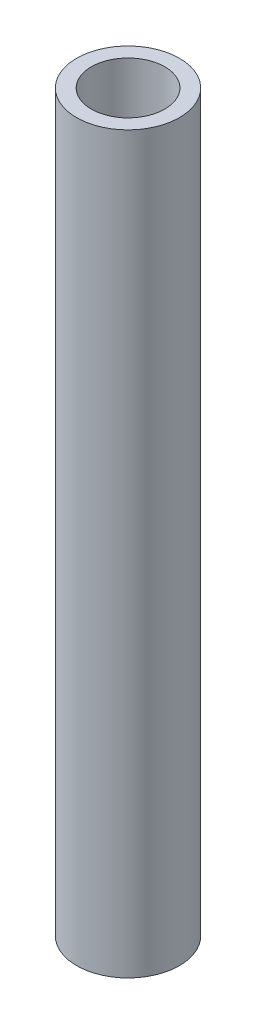
ISO-10303-21;
HEADER;
FILE_DESCRIPTION(('STEP AP214'),'2;1');
FILE_NAME('part.step','',(''),(''),'','','');
FILE_SCHEMA(('AUTOMOTIVE_DESIGN { 1 0 10303 214 1 1 1 1 }'));
ENDSEC;
DATA;
#1=APPLICATION_CONTEXT('core data for automotive mechanical design processes');
#2=APPLICATION_PROTOCOL_DEFINITION('international standard','automotive_design',2000,#1);
#3=PRODUCT_CONTEXT('',#1,'mechanical');
#4=PRODUCT('Part','Part','',(#3));
#5=PRODUCT_RELATED_PRODUCT_CATEGORY('part','',(#4));
#6=PRODUCT_DEFINITION_FORMATION('','',#4);
#7=PRODUCT_DEFINITION_CONTEXT('part definition',#1,'design');
#8=PRODUCT_DEFINITION('design','',#6,#7);
#9=PRODUCT_DEFINITION_SHAPE('','',#8);
#10=(LENGTH_UNIT() NAMED_UNIT(*) SI_UNIT(.MILLI.,.METRE.));
#11=(NAMED_UNIT(*) PLANE_ANGLE_UNIT() SI_UNIT($,.RADIAN.));
#12=(NAMED_UNIT(*) SI_UNIT($,.STERADIAN.) SOLID_ANGLE_UNIT());
#13=UNCERTAINTY_MEASURE_WITH_UNIT(LENGTH_MEASURE(1.E-05),#10,'distance_accuracy_value','');
#14=(GEOMETRIC_REPRESENTATION_CONTEXT(3) GLOBAL_UNCERTAINTY_ASSIGNED_CONTEXT((#13)) GLOBAL_UNIT_ASSIGNED_CONTEXT((#10,
#11,#12)) REPRESENTATION_CONTEXT('',''));
#15=CARTESIAN_POINT('',(0.,0.,0.));
#16=DIRECTION('',(0.,0.,1.));
#17=DIRECTION('',(1.,0.,0.));
#18=AXIS2_PLACEMENT_3D('',#15,#16,#17);
#19=CARTESIAN_POINT('',(0.,0.,0.));
#20=DIRECTION('',(0.,-1.,0.));
#21=DIRECTION('',(0.,0.,-1.));
#22=AXIS2_PLACEMENT_3D('',#19,#20,#21);
#23=CYLINDRICAL_SURFACE('',#22,1.5);
#24=CARTESIAN_POINT('',(0.,30.,0.));
#25=DIRECTION('',(0.,-1.,0.));
#26=DIRECTION('',(0.,0.,-1.));
#27=AXIS2_PLACEMENT_3D('',#24,#25,#26);
#28=CIRCLE('',#27,1.5);
#29=CARTESIAN_POINT('',(0.,30.,-1.5));
#30=VERTEX_POINT('',#29);
#31=EDGE_CURVE('E10',#30,#30,#28,.T.);
#32=ORIENTED_EDGE('',*,*,#31,.F.);
#33=EDGE_LOOP('',(#32));
#34=FACE_BOUND('',#33,.T.);
#35=CARTESIAN_POINT('',(0.,0.,0.));
#36=DIRECTION('',(0.,-1.,0.));
#37=DIRECTION('',(0.,0.,-1.));
#38=AXIS2_PLACEMENT_3D('',#35,#36,#37);
#39=CIRCLE('',#38,1.5);
#40=CARTESIAN_POINT('',(0.,0.,-1.5));
#41=VERTEX_POINT('',#40);
#42=EDGE_CURVE('E44',#41,#41,#39,.T.);
#43=ORIENTED_EDGE('',*,*,#42,.T.);
#44=EDGE_LOOP('',(#43));
#45=FACE_BOUND('',#44,.T.);
#46=ADVANCED_FACE('F30',(#34,#45),#23,.F.);
#47=CARTESIAN_POINT('',(-1.5,30.,0.));
#48=DIRECTION('',(0.,-1.,0.));
#49=DIRECTION('',(0.,0.,-1.));
#50=AXIS2_PLACEMENT_3D('',#47,#48,#49);
#51=PLANE('',#50);
#52=CARTESIAN_POINT('',(0.,30.,0.));
#53=DIRECTION('',(0.,-1.,0.));
#54=DIRECTION('',(0.,0.,-1.));
#55=AXIS2_PLACEMENT_3D('',#52,#53,#54);
#56=CIRCLE('',#55,2.1);
#57=CARTESIAN_POINT('',(0.,30.,-2.1));
#58=VERTEX_POINT('',#57);
#59=EDGE_CURVE('E36',#58,#58,#56,.T.);
#60=ORIENTED_EDGE('',*,*,#59,.F.);
#61=EDGE_LOOP('',(#60));
#62=FACE_BOUND('',#61,.T.);
#63=ORIENTED_EDGE('',*,*,#31,.T.);
#64=EDGE_LOOP('',(#63));
#65=FACE_BOUND('',#64,.T.);
#66=ADVANCED_FACE('F59',(#62,#65),#51,.F.);
#67=CARTESIAN_POINT('',(0.,0.,0.));
#68=DIRECTION('',(0.,-1.,0.));
#69=DIRECTION('',(0.,0.,-1.));
#70=AXIS2_PLACEMENT_3D('',#67,#68,#69);
#71=CYLINDRICAL_SURFACE('',#70,2.1);
#72=CARTESIAN_POINT('',(0.,0.,0.));
#73=DIRECTION('',(0.,-1.,0.));
#74=DIRECTION('',(0.,0.,-1.));
#75=AXIS2_PLACEMENT_3D('',#72,#73,#74);
#76=CIRCLE('',#75,2.1);
#77=CARTESIAN_POINT('',(0.,0.,-2.1));
#78=VERTEX_POINT('',#77);
#79=EDGE_CURVE('E40',#78,#78,#76,.T.);
#80=ORIENTED_EDGE('',*,*,#79,.F.);
#81=EDGE_LOOP('',(#80));
#82=FACE_BOUND('',#81,.T.);
#83=ORIENTED_EDGE('',*,*,#59,.T.);
#84=EDGE_LOOP('',(#83));
#85=FACE_BOUND('',#84,.T.);
#86=ADVANCED_FACE('F54',(#82,#85),#71,.T.);
#87=CARTESIAN_POINT('',(-1.5,0.,0.));
#88=DIRECTION('',(0.,1.,0.));
#89=DIRECTION('',(0.,0.,1.));
#90=AXIS2_PLACEMENT_3D('',#87,#88,#89);
#91=PLANE('',#90);
#92=ORIENTED_EDGE('',*,*,#42,.F.);
#93=EDGE_LOOP('',(#92));
#94=FACE_BOUND('',#93,.T.);
#95=ORIENTED_EDGE('',*,*,#79,.T.);
#96=EDGE_LOOP('',(#95));
#97=FACE_BOUND('',#96,.T.);
#98=ADVANCED_FACE('F51',(#94,#97),#91,.F.);
#99=CLOSED_SHELL('',(#46,#66,#86,#98));
#100=MANIFOLD_SOLID_BREP('B2',#99);
#101=ADVANCED_BREP_SHAPE_REPRESENTATION('',(#18,#100),#14);
#102=SHAPE_DEFINITION_REPRESENTATION(#9,#101);
ENDSEC;
END-ISO-10303-21;
